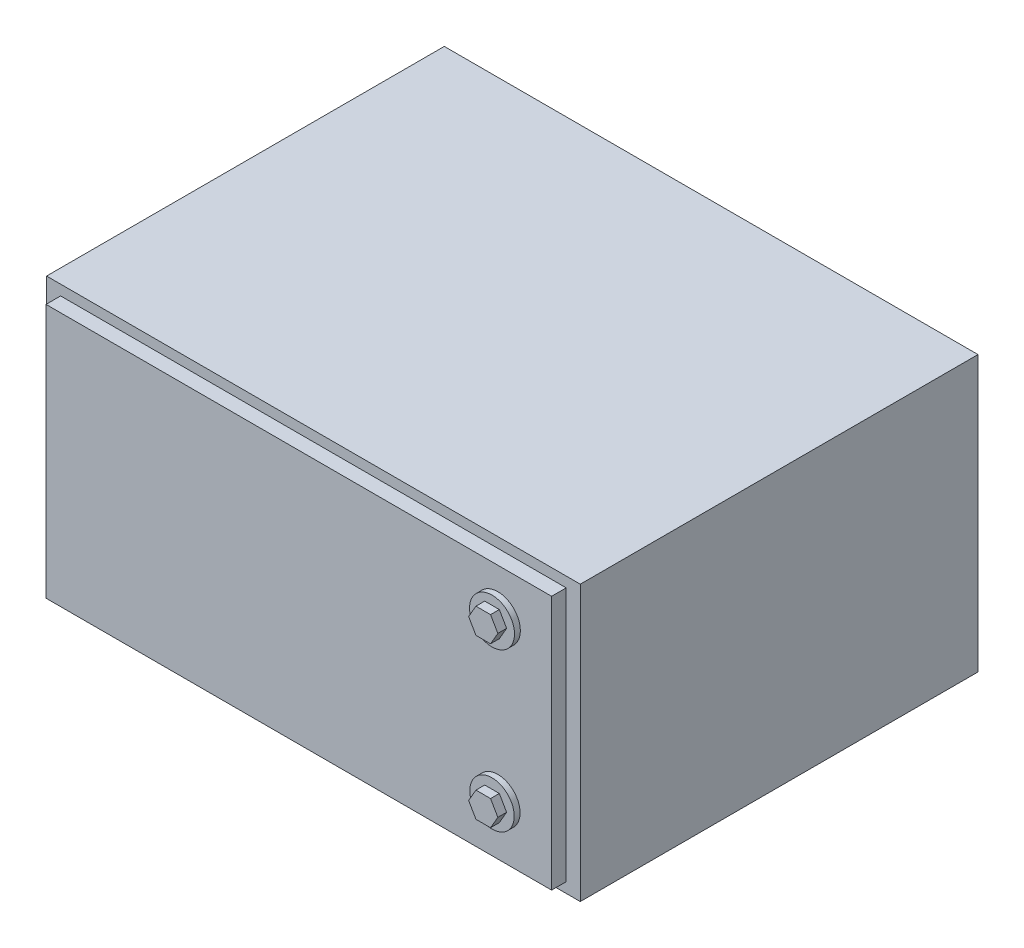
ISO-10303-21;
HEADER;
FILE_DESCRIPTION(('STEP AP214'),'2;1');
FILE_NAME('part.step','',(''),(''),'','','');
FILE_SCHEMA(('AUTOMOTIVE_DESIGN { 1 0 10303 214 1 1 1 1 }'));
ENDSEC;
DATA;
#1=APPLICATION_CONTEXT('core data for automotive mechanical design processes');
#2=APPLICATION_PROTOCOL_DEFINITION('international standard','automotive_design',2000,#1);
#3=PRODUCT_CONTEXT('',#1,'mechanical');
#4=PRODUCT('Part','Part','',(#3));
#5=PRODUCT_RELATED_PRODUCT_CATEGORY('part','',(#4));
#6=PRODUCT_DEFINITION_FORMATION('','',#4);
#7=PRODUCT_DEFINITION_CONTEXT('part definition',#1,'design');
#8=PRODUCT_DEFINITION('design','',#6,#7);
#9=PRODUCT_DEFINITION_SHAPE('','',#8);
#10=(LENGTH_UNIT() NAMED_UNIT(*) SI_UNIT(.MILLI.,.METRE.));
#11=(NAMED_UNIT(*) PLANE_ANGLE_UNIT() SI_UNIT($,.RADIAN.));
#12=(NAMED_UNIT(*) SI_UNIT($,.STERADIAN.) SOLID_ANGLE_UNIT());
#13=UNCERTAINTY_MEASURE_WITH_UNIT(LENGTH_MEASURE(1.E-05),#10,'distance_accuracy_value','');
#14=(GEOMETRIC_REPRESENTATION_CONTEXT(3) GLOBAL_UNCERTAINTY_ASSIGNED_CONTEXT((#13)) GLOBAL_UNIT_ASSIGNED_CONTEXT((#10,
#11,#12)) REPRESENTATION_CONTEXT('',''));
#15=CARTESIAN_POINT('',(0.,0.,0.));
#16=DIRECTION('',(0.,0.,1.));
#17=DIRECTION('',(1.,0.,0.));
#18=AXIS2_PLACEMENT_3D('',#15,#16,#17);
#19=CARTESIAN_POINT('',(0.,0.,282.));
#20=DIRECTION('',(0.,0.,1.));
#21=DIRECTION('',(1.,0.,0.));
#22=AXIS2_PLACEMENT_3D('',#19,#20,#21);
#23=PLANE('',#22);
#24=CARTESIAN_POINT('',(136.141228207543,-52.0416494924864,282.));
#25=DIRECTION('',(0.,0.,1.));
#26=DIRECTION('',(1.,0.,0.));
#27=AXIS2_PLACEMENT_3D('',#24,#25,#26);
#28=CIRCLE('',#27,15.186201358837);
#29=CARTESIAN_POINT('',(151.32742956638,-52.0416494924864,282.));
#30=VERTEX_POINT('',#29);
#31=EDGE_CURVE('E204',#30,#30,#28,.T.);
#32=ORIENTED_EDGE('',*,*,#31,.F.);
#33=EDGE_LOOP('',(#32));
#34=FACE_BOUND('',#33,.T.);
#35=CARTESIAN_POINT('',(136.141228207543,56.0039711148531,282.));
#36=DIRECTION('',(0.,0.,1.));
#37=DIRECTION('',(1.,0.,0.));
#38=AXIS2_PLACEMENT_3D('',#35,#36,#37);
#39=CIRCLE('',#38,15.3722972644048);
#40=CARTESIAN_POINT('',(151.513525471948,56.0039711148531,282.));
#41=VERTEX_POINT('',#40);
#42=EDGE_CURVE('E395',#41,#41,#39,.T.);
#43=ORIENTED_EDGE('',*,*,#42,.F.);
#44=EDGE_LOOP('',(#43));
#45=FACE_BOUND('',#44,.T.);
#46=DIRECTION('',(0.,1.,0.));
#47=VECTOR('',#46,1.);
#48=CARTESIAN_POINT('',(172.887438002362,87.0225831909202,282.));
#49=LINE('',#48,#47);
#50=CARTESIAN_POINT('',(172.887438002362,-87.0225831909202,282.));
#51=VERTEX_POINT('',#50);
#52=CARTESIAN_POINT('',(172.887438002362,87.0225831909202,282.));
#53=VERTEX_POINT('',#52);
#54=EDGE_CURVE('E280',#51,#53,#49,.T.);
#55=ORIENTED_EDGE('',*,*,#54,.T.);
#56=DIRECTION('',(-1.,0.,0.));
#57=VECTOR('',#56,1.);
#58=CARTESIAN_POINT('',(-172.887438002362,87.0225831909202,282.));
#59=LINE('',#58,#57);
#60=CARTESIAN_POINT('',(-172.887438002362,87.0225831909202,282.));
#61=VERTEX_POINT('',#60);
#62=EDGE_CURVE('E284',#53,#61,#59,.T.);
#63=ORIENTED_EDGE('',*,*,#62,.T.);
#64=DIRECTION('',(0.,-1.,0.));
#65=VECTOR('',#64,1.);
#66=CARTESIAN_POINT('',(-172.887438002362,87.0225831909202,282.));
#67=LINE('',#66,#65);
#68=CARTESIAN_POINT('',(-172.887438002362,-87.0225831909202,282.));
#69=VERTEX_POINT('',#68);
#70=EDGE_CURVE('E288',#61,#69,#67,.T.);
#71=ORIENTED_EDGE('',*,*,#70,.T.);
#72=DIRECTION('',(1.,0.,0.));
#73=VECTOR('',#72,1.);
#74=CARTESIAN_POINT('',(-172.887438002362,-87.0225831909202,282.));
#75=LINE('',#74,#73);
#76=EDGE_CURVE('E291',#69,#51,#75,.T.);
#77=ORIENTED_EDGE('',*,*,#76,.T.);
#78=EDGE_LOOP('',(#55,#63,#71,#77));
#79=FACE_BOUND('',#78,.T.);
#80=ADVANCED_FACE('F51',(#34,#45,#79),#23,.T.);
#81=CARTESIAN_POINT('',(182.5,94.,272.));
#82=DIRECTION('',(-1.,0.,0.));
#83=DIRECTION('',(0.,-1.,0.));
#84=AXIS2_PLACEMENT_3D('',#81,#82,#83);
#85=PLANE('',#84);
#86=DIRECTION('',(0.,1.,0.));
#87=VECTOR('',#86,1.);
#88=CARTESIAN_POINT('',(182.5,94.,0.));
#89=LINE('',#88,#87);
#90=CARTESIAN_POINT('',(182.5,-94.,0.));
#91=VERTEX_POINT('',#90);
#92=CARTESIAN_POINT('',(182.5,94.,0.));
#93=VERTEX_POINT('',#92);
#94=EDGE_CURVE('E324',#91,#93,#89,.T.);
#95=ORIENTED_EDGE('',*,*,#94,.T.);
#96=DIRECTION('',(0.,0.,-1.));
#97=VECTOR('',#96,1.);
#98=CARTESIAN_POINT('',(182.5,94.,272.));
#99=LINE('',#98,#97);
#100=CARTESIAN_POINT('',(182.5,94.,272.));
#101=VERTEX_POINT('',#100);
#102=EDGE_CURVE('E362',#101,#93,#99,.T.);
#103=ORIENTED_EDGE('',*,*,#102,.F.);
#104=DIRECTION('',(0.,1.,0.));
#105=VECTOR('',#104,1.);
#106=CARTESIAN_POINT('',(182.5,94.,272.));
#107=LINE('',#106,#105);
#108=CARTESIAN_POINT('',(182.5,-94.,272.));
#109=VERTEX_POINT('',#108);
#110=EDGE_CURVE('E325',#109,#101,#107,.T.);
#111=ORIENTED_EDGE('',*,*,#110,.F.);
#112=DIRECTION('',(0.,0.,-1.));
#113=VECTOR('',#112,1.);
#114=CARTESIAN_POINT('',(182.5,-94.,272.));
#115=LINE('',#114,#113);
#116=EDGE_CURVE('E339',#109,#91,#115,.T.);
#117=ORIENTED_EDGE('',*,*,#116,.T.);
#118=EDGE_LOOP('',(#95,#103,#111,#117));
#119=FACE_BOUND('',#118,.T.);
#120=ADVANCED_FACE('F53',(#119),#85,.F.);
#121=CARTESIAN_POINT('',(-182.5,94.,272.));
#122=DIRECTION('',(0.,-1.,0.));
#123=DIRECTION('',(0.,0.,-1.));
#124=AXIS2_PLACEMENT_3D('',#121,#122,#123);
#125=PLANE('',#124);
#126=DIRECTION('',(-1.,0.,0.));
#127=VECTOR('',#126,1.);
#128=CARTESIAN_POINT('',(-182.5,94.,0.));
#129=LINE('',#128,#127);
#130=CARTESIAN_POINT('',(-182.5,94.,0.));
#131=VERTEX_POINT('',#130);
#132=EDGE_CURVE('E343',#93,#131,#129,.T.);
#133=ORIENTED_EDGE('',*,*,#132,.T.);
#134=DIRECTION('',(0.,0.,-1.));
#135=VECTOR('',#134,1.);
#136=CARTESIAN_POINT('',(-182.5,94.,272.));
#137=LINE('',#136,#135);
#138=CARTESIAN_POINT('',(-182.5,94.,272.));
#139=VERTEX_POINT('',#138);
#140=EDGE_CURVE('E358',#139,#131,#137,.T.);
#141=ORIENTED_EDGE('',*,*,#140,.F.);
#142=DIRECTION('',(-1.,0.,0.));
#143=VECTOR('',#142,1.);
#144=CARTESIAN_POINT('',(-182.5,94.,272.));
#145=LINE('',#144,#143);
#146=EDGE_CURVE('E329',#101,#139,#145,.T.);
#147=ORIENTED_EDGE('',*,*,#146,.F.);
#148=ORIENTED_EDGE('',*,*,#102,.T.);
#149=EDGE_LOOP('',(#133,#141,#147,#148));
#150=FACE_BOUND('',#149,.T.);
#151=ADVANCED_FACE('F479',(#150),#125,.F.);
#152=CARTESIAN_POINT('',(-182.5,94.,272.));
#153=DIRECTION('',(1.,0.,0.));
#154=DIRECTION('',(0.,0.,-1.));
#155=AXIS2_PLACEMENT_3D('',#152,#153,#154);
#156=PLANE('',#155);
#157=DIRECTION('',(0.,-1.,0.));
#158=VECTOR('',#157,1.);
#159=CARTESIAN_POINT('',(-182.5,94.,0.));
#160=LINE('',#159,#158);
#161=CARTESIAN_POINT('',(-182.5,-94.,0.));
#162=VERTEX_POINT('',#161);
#163=EDGE_CURVE('E346',#131,#162,#160,.T.);
#164=ORIENTED_EDGE('',*,*,#163,.T.);
#165=DIRECTION('',(0.,0.,-1.));
#166=VECTOR('',#165,1.);
#167=CARTESIAN_POINT('',(-182.5,-94.,272.));
#168=LINE('',#167,#166);
#169=CARTESIAN_POINT('',(-182.5,-94.,272.));
#170=VERTEX_POINT('',#169);
#171=EDGE_CURVE('E354',#170,#162,#168,.T.);
#172=ORIENTED_EDGE('',*,*,#171,.F.);
#173=DIRECTION('',(0.,-1.,0.));
#174=VECTOR('',#173,1.);
#175=CARTESIAN_POINT('',(-182.5,94.,272.));
#176=LINE('',#175,#174);
#177=EDGE_CURVE('E333',#139,#170,#176,.T.);
#178=ORIENTED_EDGE('',*,*,#177,.F.);
#179=ORIENTED_EDGE('',*,*,#140,.T.);
#180=EDGE_LOOP('',(#164,#172,#178,#179));
#181=FACE_BOUND('',#180,.T.);
#182=ADVANCED_FACE('F484',(#181),#156,.F.);
#183=CARTESIAN_POINT('',(-182.5,-94.,272.));
#184=DIRECTION('',(0.,1.,0.));
#185=DIRECTION('',(0.,0.,1.));
#186=AXIS2_PLACEMENT_3D('',#183,#184,#185);
#187=PLANE('',#186);
#188=DIRECTION('',(1.,0.,0.));
#189=VECTOR('',#188,1.);
#190=CARTESIAN_POINT('',(-182.5,-94.,0.));
#191=LINE('',#190,#189);
#192=EDGE_CURVE('E330',#162,#91,#191,.T.);
#193=ORIENTED_EDGE('',*,*,#192,.T.);
#194=ORIENTED_EDGE('',*,*,#116,.F.);
#195=DIRECTION('',(1.,0.,0.));
#196=VECTOR('',#195,1.);
#197=CARTESIAN_POINT('',(-182.5,-94.,272.));
#198=LINE('',#197,#196);
#199=EDGE_CURVE('E336',#170,#109,#198,.T.);
#200=ORIENTED_EDGE('',*,*,#199,.F.);
#201=ORIENTED_EDGE('',*,*,#171,.T.);
#202=EDGE_LOOP('',(#193,#194,#200,#201));
#203=FACE_BOUND('',#202,.T.);
#204=ADVANCED_FACE('F469',(#203),#187,.F.);
#205=CARTESIAN_POINT('',(0.,0.,272.));
#206=DIRECTION('',(0.,0.,1.));
#207=DIRECTION('',(1.,0.,0.));
#208=AXIS2_PLACEMENT_3D('',#205,#206,#207);
#209=PLANE('',#208);
#210=DIRECTION('',(0.,1.,0.));
#211=VECTOR('',#210,1.);
#212=CARTESIAN_POINT('',(172.887438002362,87.0225831909202,272.));
#213=LINE('',#212,#211);
#214=CARTESIAN_POINT('',(172.887438002362,-87.0225831909202,272.));
#215=VERTEX_POINT('',#214);
#216=CARTESIAN_POINT('',(172.887438002362,87.0225831909202,272.));
#217=VERTEX_POINT('',#216);
#218=EDGE_CURVE('E279',#215,#217,#213,.T.);
#219=ORIENTED_EDGE('',*,*,#218,.F.);
#220=DIRECTION('',(1.,0.,0.));
#221=VECTOR('',#220,1.);
#222=CARTESIAN_POINT('',(-172.887438002362,-87.0225831909202,272.));
#223=LINE('',#222,#221);
#224=CARTESIAN_POINT('',(-172.887438002362,-87.0225831909202,272.));
#225=VERTEX_POINT('',#224);
#226=EDGE_CURVE('E285',#225,#215,#223,.T.);
#227=ORIENTED_EDGE('',*,*,#226,.F.);
#228=DIRECTION('',(0.,-1.,0.));
#229=VECTOR('',#228,1.);
#230=CARTESIAN_POINT('',(-172.887438002362,87.0225831909202,272.));
#231=LINE('',#230,#229);
#232=CARTESIAN_POINT('',(-172.887438002362,87.0225831909202,272.));
#233=VERTEX_POINT('',#232);
#234=EDGE_CURVE('E302',#233,#225,#231,.T.);
#235=ORIENTED_EDGE('',*,*,#234,.F.);
#236=DIRECTION('',(-1.,0.,0.));
#237=VECTOR('',#236,1.);
#238=CARTESIAN_POINT('',(-172.887438002362,87.0225831909202,272.));
#239=LINE('',#238,#237);
#240=EDGE_CURVE('E298',#217,#233,#239,.T.);
#241=ORIENTED_EDGE('',*,*,#240,.F.);
#242=EDGE_LOOP('',(#219,#227,#235,#241));
#243=FACE_BOUND('',#242,.T.);
#244=ORIENTED_EDGE('',*,*,#110,.T.);
#245=ORIENTED_EDGE('',*,*,#146,.T.);
#246=ORIENTED_EDGE('',*,*,#177,.T.);
#247=ORIENTED_EDGE('',*,*,#199,.T.);
#248=EDGE_LOOP('',(#244,#245,#246,#247));
#249=FACE_BOUND('',#248,.T.);
#250=ADVANCED_FACE('F465',(#243,#249),#209,.T.);
#251=CARTESIAN_POINT('',(0.,0.,0.));
#252=DIRECTION('',(0.,0.,1.));
#253=DIRECTION('',(1.,0.,0.));
#254=AXIS2_PLACEMENT_3D('',#251,#252,#253);
#255=PLANE('',#254);
#256=ORIENTED_EDGE('',*,*,#94,.F.);
#257=ORIENTED_EDGE('',*,*,#192,.F.);
#258=ORIENTED_EDGE('',*,*,#163,.F.);
#259=ORIENTED_EDGE('',*,*,#132,.F.);
#260=EDGE_LOOP('',(#256,#257,#258,#259));
#261=FACE_BOUND('',#260,.T.);
#262=ADVANCED_FACE('F468',(#261),#255,.F.);
#263=CARTESIAN_POINT('',(172.887438002362,87.0225831909202,282.));
#264=DIRECTION('',(-1.,0.,0.));
#265=DIRECTION('',(0.,0.,1.));
#266=AXIS2_PLACEMENT_3D('',#263,#264,#265);
#267=PLANE('',#266);
#268=ORIENTED_EDGE('',*,*,#218,.T.);
#269=DIRECTION('',(0.,0.,-1.));
#270=VECTOR('',#269,1.);
#271=CARTESIAN_POINT('',(172.887438002362,87.0225831909202,282.));
#272=LINE('',#271,#270);
#273=EDGE_CURVE('E320',#53,#217,#272,.T.);
#274=ORIENTED_EDGE('',*,*,#273,.F.);
#275=ORIENTED_EDGE('',*,*,#54,.F.);
#276=DIRECTION('',(0.,0.,-1.));
#277=VECTOR('',#276,1.);
#278=CARTESIAN_POINT('',(172.887438002362,-87.0225831909202,282.));
#279=LINE('',#278,#277);
#280=EDGE_CURVE('E294',#51,#215,#279,.T.);
#281=ORIENTED_EDGE('',*,*,#280,.T.);
#282=EDGE_LOOP('',(#268,#274,#275,#281));
#283=FACE_BOUND('',#282,.T.);
#284=ADVANCED_FACE('F455',(#283),#267,.F.);
#285=CARTESIAN_POINT('',(-172.887438002362,87.0225831909202,282.));
#286=DIRECTION('',(0.,-1.,0.));
#287=DIRECTION('',(0.,0.,-1.));
#288=AXIS2_PLACEMENT_3D('',#285,#286,#287);
#289=PLANE('',#288);
#290=ORIENTED_EDGE('',*,*,#240,.T.);
#291=DIRECTION('',(0.,0.,-1.));
#292=VECTOR('',#291,1.);
#293=CARTESIAN_POINT('',(-172.887438002362,87.0225831909202,282.));
#294=LINE('',#293,#292);
#295=EDGE_CURVE('E316',#61,#233,#294,.T.);
#296=ORIENTED_EDGE('',*,*,#295,.F.);
#297=ORIENTED_EDGE('',*,*,#62,.F.);
#298=ORIENTED_EDGE('',*,*,#273,.T.);
#299=EDGE_LOOP('',(#290,#296,#297,#298));
#300=FACE_BOUND('',#299,.T.);
#301=ADVANCED_FACE('F457',(#300),#289,.F.);
#302=CARTESIAN_POINT('',(-172.887438002362,87.0225831909202,282.));
#303=DIRECTION('',(1.,0.,0.));
#304=DIRECTION('',(0.,0.,-1.));
#305=AXIS2_PLACEMENT_3D('',#302,#303,#304);
#306=PLANE('',#305);
#307=ORIENTED_EDGE('',*,*,#234,.T.);
#308=DIRECTION('',(0.,0.,-1.));
#309=VECTOR('',#308,1.);
#310=CARTESIAN_POINT('',(-172.887438002362,-87.0225831909202,282.));
#311=LINE('',#310,#309);
#312=EDGE_CURVE('E312',#69,#225,#311,.T.);
#313=ORIENTED_EDGE('',*,*,#312,.F.);
#314=ORIENTED_EDGE('',*,*,#70,.F.);
#315=ORIENTED_EDGE('',*,*,#295,.T.);
#316=EDGE_LOOP('',(#307,#313,#314,#315));
#317=FACE_BOUND('',#316,.T.);
#318=ADVANCED_FACE('F461',(#317),#306,.F.);
#319=CARTESIAN_POINT('',(-172.887438002362,-87.0225831909202,282.));
#320=DIRECTION('',(0.,1.,0.));
#321=DIRECTION('',(0.,0.,1.));
#322=AXIS2_PLACEMENT_3D('',#319,#320,#321);
#323=PLANE('',#322);
#324=ORIENTED_EDGE('',*,*,#226,.T.);
#325=ORIENTED_EDGE('',*,*,#280,.F.);
#326=ORIENTED_EDGE('',*,*,#76,.F.);
#327=ORIENTED_EDGE('',*,*,#312,.T.);
#328=EDGE_LOOP('',(#324,#325,#326,#327));
#329=FACE_BOUND('',#328,.T.);
#330=ADVANCED_FACE('F463',(#329),#323,.F.);
#331=CARTESIAN_POINT('',(136.141228207543,56.0039711148531,286.));
#332=DIRECTION('',(0.,0.,1.));
#333=DIRECTION('',(1.,0.,0.));
#334=AXIS2_PLACEMENT_3D('',#331,#332,#333);
#335=PLANE('',#334);
#336=CARTESIAN_POINT('',(136.141228207543,56.0039711148531,286.));
#337=DIRECTION('',(0.,0.,1.));
#338=DIRECTION('',(1.,0.,0.));
#339=AXIS2_PLACEMENT_3D('',#336,#337,#338);
#340=CIRCLE('',#339,15.3722972644048);
#341=CARTESIAN_POINT('',(151.513525471948,56.0039711148531,286.));
#342=VERTEX_POINT('',#341);
#343=EDGE_CURVE('E388',#342,#342,#340,.T.);
#344=ORIENTED_EDGE('',*,*,#343,.T.);
#345=EDGE_LOOP('',(#344));
#346=FACE_BOUND('',#345,.T.);
#347=DIRECTION('',(0.499999999999994,0.866025403784442,0.));
#348=VECTOR('',#347,1.);
#349=CARTESIAN_POINT('',(141.134054034866,47.9947144035055,286.));
#350=LINE('',#349,#348);
#351=CARTESIAN_POINT('',(141.134054034866,47.9947144035055,286.));
#352=VERTEX_POINT('',#351);
#353=CARTESIAN_POINT('',(146.12687986219,56.6425424097719,286.));
#354=VERTEX_POINT('',#353);
#355=EDGE_CURVE('E74',#352,#354,#350,.T.);
#356=ORIENTED_EDGE('',*,*,#355,.F.);
#357=DIRECTION('',(1.,0.,0.));
#358=VECTOR('',#357,1.);
#359=CARTESIAN_POINT('',(131.148402380219,47.9947144035054,286.));
#360=LINE('',#359,#358);
#361=CARTESIAN_POINT('',(131.148402380219,47.9947144035054,286.));
#362=VERTEX_POINT('',#361);
#363=EDGE_CURVE('E60',#362,#352,#360,.T.);
#364=ORIENTED_EDGE('',*,*,#363,.F.);
#365=DIRECTION('',(0.500000000000007,-0.866025403784434,0.));
#366=VECTOR('',#365,1.);
#367=CARTESIAN_POINT('',(126.155576552896,56.6425424097718,286.));
#368=LINE('',#367,#366);
#369=CARTESIAN_POINT('',(126.155576552896,56.6425424097718,286.));
#370=VERTEX_POINT('',#369);
#371=EDGE_CURVE('E384',#370,#362,#368,.T.);
#372=ORIENTED_EDGE('',*,*,#371,.F.);
#373=DIRECTION('',(-0.499999999999996,-0.866025403784441,0.));
#374=VECTOR('',#373,1.);
#375=CARTESIAN_POINT('',(131.148402380219,65.2903704160383,286.));
#376=LINE('',#375,#374);
#377=CARTESIAN_POINT('',(131.148402380219,65.2903704160383,286.));
#378=VERTEX_POINT('',#377);
#379=EDGE_CURVE('E387',#378,#370,#376,.T.);
#380=ORIENTED_EDGE('',*,*,#379,.F.);
#381=DIRECTION('',(-1.,0.,0.));
#382=VECTOR('',#381,1.);
#383=CARTESIAN_POINT('',(141.134054034866,65.2903704160383,286.));
#384=LINE('',#383,#382);
#385=CARTESIAN_POINT('',(141.134054034866,65.2903704160383,286.));
#386=VERTEX_POINT('',#385);
#387=EDGE_CURVE('E392',#386,#378,#384,.T.);
#388=ORIENTED_EDGE('',*,*,#387,.F.);
#389=DIRECTION('',(-0.500000000000002,0.866025403784438,0.));
#390=VECTOR('',#389,1.);
#391=CARTESIAN_POINT('',(146.12687986219,56.6425424097719,286.));
#392=LINE('',#391,#390);
#393=EDGE_CURVE('E402',#354,#386,#392,.T.);
#394=ORIENTED_EDGE('',*,*,#393,.F.);
#395=EDGE_LOOP('',(#356,#364,#372,#380,#388,#394));
#396=FACE_BOUND('',#395,.T.);
#397=ADVANCED_FACE('F562',(#346,#396),#335,.T.);
#398=CARTESIAN_POINT('',(136.141228207543,56.0039711148531,286.));
#399=DIRECTION('',(0.,0.,-1.));
#400=DIRECTION('',(-1.,0.,0.));
#401=AXIS2_PLACEMENT_3D('',#398,#399,#400);
#402=CYLINDRICAL_SURFACE('',#401,15.3722972644048);
#403=ORIENTED_EDGE('',*,*,#343,.F.);
#404=EDGE_LOOP('',(#403));
#405=FACE_BOUND('',#404,.T.);
#406=ORIENTED_EDGE('',*,*,#42,.T.);
#407=EDGE_LOOP('',(#406));
#408=FACE_BOUND('',#407,.T.);
#409=ADVANCED_FACE('F443',(#405,#408),#402,.T.);
#410=CARTESIAN_POINT('',(0.,0.,292.));
#411=DIRECTION('',(0.,0.,1.));
#412=DIRECTION('',(1.,0.,0.));
#413=AXIS2_PLACEMENT_3D('',#410,#411,#412);
#414=PLANE('',#413);
#415=DIRECTION('',(0.499999999999994,0.866025403784442,0.));
#416=VECTOR('',#415,1.);
#417=CARTESIAN_POINT('',(141.134054034866,47.9947144035055,292.));
#418=LINE('',#417,#416);
#419=CARTESIAN_POINT('',(141.134054034866,47.9947144035055,292.));
#420=VERTEX_POINT('',#419);
#421=CARTESIAN_POINT('',(146.12687986219,56.6425424097719,292.));
#422=VERTEX_POINT('',#421);
#423=EDGE_CURVE('E236',#420,#422,#418,.T.);
#424=ORIENTED_EDGE('',*,*,#423,.T.);
#425=DIRECTION('',(-0.500000000000002,0.866025403784438,0.));
#426=VECTOR('',#425,1.);
#427=CARTESIAN_POINT('',(146.12687986219,56.6425424097719,292.));
#428=LINE('',#427,#426);
#429=CARTESIAN_POINT('',(141.134054034866,65.2903704160383,292.));
#430=VERTEX_POINT('',#429);
#431=EDGE_CURVE('E240',#422,#430,#428,.T.);
#432=ORIENTED_EDGE('',*,*,#431,.T.);
#433=DIRECTION('',(-1.,0.,0.));
#434=VECTOR('',#433,1.);
#435=CARTESIAN_POINT('',(141.134054034866,65.2903704160383,292.));
#436=LINE('',#435,#434);
#437=CARTESIAN_POINT('',(131.148402380219,65.2903704160383,292.));
#438=VERTEX_POINT('',#437);
#439=EDGE_CURVE('E243',#430,#438,#436,.T.);
#440=ORIENTED_EDGE('',*,*,#439,.T.);
#441=DIRECTION('',(-0.499999999999996,-0.866025403784441,0.));
#442=VECTOR('',#441,1.);
#443=CARTESIAN_POINT('',(131.148402380219,65.2903704160383,292.));
#444=LINE('',#443,#442);
#445=CARTESIAN_POINT('',(126.155576552896,56.6425424097718,292.));
#446=VERTEX_POINT('',#445);
#447=EDGE_CURVE('E246',#438,#446,#444,.T.);
#448=ORIENTED_EDGE('',*,*,#447,.T.);
#449=DIRECTION('',(0.500000000000007,-0.866025403784434,0.));
#450=VECTOR('',#449,1.);
#451=CARTESIAN_POINT('',(126.155576552896,56.6425424097718,292.));
#452=LINE('',#451,#450);
#453=CARTESIAN_POINT('',(131.148402380219,47.9947144035054,292.));
#454=VERTEX_POINT('',#453);
#455=EDGE_CURVE('E249',#446,#454,#452,.T.);
#456=ORIENTED_EDGE('',*,*,#455,.T.);
#457=DIRECTION('',(1.,0.,0.));
#458=VECTOR('',#457,1.);
#459=CARTESIAN_POINT('',(131.148402380219,47.9947144035054,292.));
#460=LINE('',#459,#458);
#461=EDGE_CURVE('E252',#454,#420,#460,.T.);
#462=ORIENTED_EDGE('',*,*,#461,.T.);
#463=EDGE_LOOP('',(#424,#432,#440,#448,#456,#462));
#464=FACE_BOUND('',#463,.T.);
#465=ADVANCED_FACE('F377',(#464),#414,.T.);
#466=CARTESIAN_POINT('',(131.148402380219,47.9947144035054,292.));
#467=DIRECTION('',(0.,1.,0.));
#468=DIRECTION('',(-1.,0.,0.));
#469=AXIS2_PLACEMENT_3D('',#466,#467,#468);
#470=PLANE('',#469);
#471=DIRECTION('',(0.,0.,-1.));
#472=VECTOR('',#471,1.);
#473=CARTESIAN_POINT('',(131.148402380219,47.9947144035054,292.));
#474=LINE('',#473,#472);
#475=EDGE_CURVE('E259',#454,#362,#474,.T.);
#476=ORIENTED_EDGE('',*,*,#475,.T.);
#477=ORIENTED_EDGE('',*,*,#363,.T.);
#478=DIRECTION('',(0.,0.,-1.));
#479=VECTOR('',#478,1.);
#480=CARTESIAN_POINT('',(141.134054034866,47.9947144035055,292.));
#481=LINE('',#480,#479);
#482=EDGE_CURVE('E255',#420,#352,#481,.T.);
#483=ORIENTED_EDGE('',*,*,#482,.F.);
#484=ORIENTED_EDGE('',*,*,#461,.F.);
#485=EDGE_LOOP('',(#476,#477,#483,#484));
#486=FACE_BOUND('',#485,.T.);
#487=ADVANCED_FACE('F368',(#486),#470,.F.);
#488=CARTESIAN_POINT('',(126.155576552896,56.6425424097718,292.));
#489=DIRECTION('',(0.866025403784434,0.500000000000007,0.));
#490=DIRECTION('',(-0.500000000000007,0.866025403784434,0.));
#491=AXIS2_PLACEMENT_3D('',#488,#489,#490);
#492=PLANE('',#491);
#493=DIRECTION('',(0.,0.,-1.));
#494=VECTOR('',#493,1.);
#495=CARTESIAN_POINT('',(126.155576552896,56.6425424097718,292.));
#496=LINE('',#495,#494);
#497=EDGE_CURVE('E263',#446,#370,#496,.T.);
#498=ORIENTED_EDGE('',*,*,#497,.T.);
#499=ORIENTED_EDGE('',*,*,#371,.T.);
#500=ORIENTED_EDGE('',*,*,#475,.F.);
#501=ORIENTED_EDGE('',*,*,#455,.F.);
#502=EDGE_LOOP('',(#498,#499,#500,#501));
#503=FACE_BOUND('',#502,.T.);
#504=ADVANCED_FACE('F383',(#503),#492,.F.);
#505=CARTESIAN_POINT('',(131.148402380219,65.2903704160383,292.));
#506=DIRECTION('',(0.866025403784441,-0.499999999999996,0.));
#507=DIRECTION('',(0.499999999999996,0.866025403784441,0.));
#508=AXIS2_PLACEMENT_3D('',#505,#506,#507);
#509=PLANE('',#508);
#510=DIRECTION('',(0.,0.,-1.));
#511=VECTOR('',#510,1.);
#512=CARTESIAN_POINT('',(131.148402380219,65.2903704160383,292.));
#513=LINE('',#512,#511);
#514=EDGE_CURVE('E267',#438,#378,#513,.T.);
#515=ORIENTED_EDGE('',*,*,#514,.T.);
#516=ORIENTED_EDGE('',*,*,#379,.T.);
#517=ORIENTED_EDGE('',*,*,#497,.F.);
#518=ORIENTED_EDGE('',*,*,#447,.F.);
#519=EDGE_LOOP('',(#515,#516,#517,#518));
#520=FACE_BOUND('',#519,.T.);
#521=ADVANCED_FACE('F605',(#520),#509,.F.);
#522=CARTESIAN_POINT('',(141.134054034866,65.2903704160383,292.));
#523=DIRECTION('',(0.,-1.,0.));
#524=DIRECTION('',(1.,0.,0.));
#525=AXIS2_PLACEMENT_3D('',#522,#523,#524);
#526=PLANE('',#525);
#527=DIRECTION('',(0.,0.,-1.));
#528=VECTOR('',#527,1.);
#529=CARTESIAN_POINT('',(141.134054034866,65.2903704160383,292.));
#530=LINE('',#529,#528);
#531=EDGE_CURVE('E271',#430,#386,#530,.T.);
#532=ORIENTED_EDGE('',*,*,#531,.T.);
#533=ORIENTED_EDGE('',*,*,#387,.T.);
#534=ORIENTED_EDGE('',*,*,#514,.F.);
#535=ORIENTED_EDGE('',*,*,#439,.F.);
#536=EDGE_LOOP('',(#532,#533,#534,#535));
#537=FACE_BOUND('',#536,.T.);
#538=ADVANCED_FACE('F593',(#537),#526,.F.);
#539=CARTESIAN_POINT('',(146.12687986219,56.6425424097719,292.));
#540=DIRECTION('',(-0.866025403784438,-0.500000000000002,0.));
#541=DIRECTION('',(0.500000000000002,-0.866025403784438,0.));
#542=AXIS2_PLACEMENT_3D('',#539,#540,#541);
#543=PLANE('',#542);
#544=DIRECTION('',(0.,0.,-1.));
#545=VECTOR('',#544,1.);
#546=CARTESIAN_POINT('',(146.12687986219,56.6425424097719,292.));
#547=LINE('',#546,#545);
#548=EDGE_CURVE('E275',#422,#354,#547,.T.);
#549=ORIENTED_EDGE('',*,*,#548,.T.);
#550=ORIENTED_EDGE('',*,*,#393,.T.);
#551=ORIENTED_EDGE('',*,*,#531,.F.);
#552=ORIENTED_EDGE('',*,*,#431,.F.);
#553=EDGE_LOOP('',(#549,#550,#551,#552));
#554=FACE_BOUND('',#553,.T.);
#555=ADVANCED_FACE('F581',(#554),#543,.F.);
#556=CARTESIAN_POINT('',(141.134054034866,47.9947144035055,292.));
#557=DIRECTION('',(-0.866025403784442,0.499999999999994,0.));
#558=DIRECTION('',(-0.499999999999994,-0.866025403784442,0.));
#559=AXIS2_PLACEMENT_3D('',#556,#557,#558);
#560=PLANE('',#559);
#561=ORIENTED_EDGE('',*,*,#482,.T.);
#562=ORIENTED_EDGE('',*,*,#355,.T.);
#563=ORIENTED_EDGE('',*,*,#548,.F.);
#564=ORIENTED_EDGE('',*,*,#423,.F.);
#565=EDGE_LOOP('',(#561,#562,#563,#564));
#566=FACE_BOUND('',#565,.T.);
#567=ADVANCED_FACE('F374',(#566),#560,.F.);
#568=CARTESIAN_POINT('',(136.141228207543,-52.0416494924864,286.));
#569=DIRECTION('',(0.,0.,1.));
#570=DIRECTION('',(1.,0.,0.));
#571=AXIS2_PLACEMENT_3D('',#568,#569,#570);
#572=PLANE('',#571);
#573=CARTESIAN_POINT('',(136.141228207543,-52.0416494924864,286.));
#574=DIRECTION('',(0.,0.,1.));
#575=DIRECTION('',(1.,0.,0.));
#576=AXIS2_PLACEMENT_3D('',#573,#574,#575);
#577=CIRCLE('',#576,15.186201358837);
#578=CARTESIAN_POINT('',(151.32742956638,-52.0416494924864,286.));
#579=VERTEX_POINT('',#578);
#580=EDGE_CURVE('E814',#579,#579,#577,.T.);
#581=ORIENTED_EDGE('',*,*,#580,.T.);
#582=EDGE_LOOP('',(#581));
#583=FACE_BOUND('',#582,.T.);
#584=DIRECTION('',(0.499999999999995,0.866025403784441,0.));
#585=VECTOR('',#584,1.);
#586=CARTESIAN_POINT('',(141.134054034866,-60.9373744069267,286.));
#587=LINE('',#586,#585);
#588=CARTESIAN_POINT('',(141.134054034866,-60.9373744069267,286.));
#589=VERTEX_POINT('',#588);
#590=CARTESIAN_POINT('',(146.12687986219,-52.2895464006603,286.));
#591=VERTEX_POINT('',#590);
#592=EDGE_CURVE('E67',#589,#591,#587,.T.);
#593=ORIENTED_EDGE('',*,*,#592,.F.);
#594=DIRECTION('',(1.,0.,0.));
#595=VECTOR('',#594,1.);
#596=CARTESIAN_POINT('',(131.148402380219,-60.9373744069268,286.));
#597=LINE('',#596,#595);
#598=CARTESIAN_POINT('',(131.148402380219,-60.9373744069268,286.));
#599=VERTEX_POINT('',#598);
#600=EDGE_CURVE('E11',#599,#589,#597,.T.);
#601=ORIENTED_EDGE('',*,*,#600,.F.);
#602=DIRECTION('',(0.500000000000006,-0.866025403784435,0.));
#603=VECTOR('',#602,1.);
#604=CARTESIAN_POINT('',(126.155576552896,-52.2895464006604,286.));
#605=LINE('',#604,#603);
#606=CARTESIAN_POINT('',(126.155576552896,-52.2895464006604,286.));
#607=VERTEX_POINT('',#606);
#608=EDGE_CURVE('E187',#607,#599,#605,.T.);
#609=ORIENTED_EDGE('',*,*,#608,.F.);
#610=DIRECTION('',(-0.499999999999995,-0.866025403784442,0.));
#611=VECTOR('',#610,1.);
#612=CARTESIAN_POINT('',(131.148402380219,-43.641718394394,286.));
#613=LINE('',#612,#611);
#614=CARTESIAN_POINT('',(131.148402380219,-43.641718394394,286.));
#615=VERTEX_POINT('',#614);
#616=EDGE_CURVE('E203',#615,#607,#613,.T.);
#617=ORIENTED_EDGE('',*,*,#616,.F.);
#618=DIRECTION('',(-1.,0.,0.));
#619=VECTOR('',#618,1.);
#620=CARTESIAN_POINT('',(141.134054034866,-43.6417183943939,286.));
#621=LINE('',#620,#619);
#622=CARTESIAN_POINT('',(141.134054034866,-43.6417183943939,286.));
#623=VERTEX_POINT('',#622);
#624=EDGE_CURVE('E425',#623,#615,#621,.T.);
#625=ORIENTED_EDGE('',*,*,#624,.F.);
#626=DIRECTION('',(-0.500000000000001,0.866025403784438,0.));
#627=VECTOR('',#626,1.);
#628=CARTESIAN_POINT('',(146.12687986219,-52.2895464006603,286.));
#629=LINE('',#628,#627);
#630=EDGE_CURVE('E429',#591,#623,#629,.T.);
#631=ORIENTED_EDGE('',*,*,#630,.F.);
#632=EDGE_LOOP('',(#593,#601,#609,#617,#625,#631));
#633=FACE_BOUND('',#632,.T.);
#634=ADVANCED_FACE('F186',(#583,#633),#572,.T.);
#635=CARTESIAN_POINT('',(136.141228207543,-52.0416494924864,286.));
#636=DIRECTION('',(0.,0.,-1.));
#637=DIRECTION('',(-1.,0.,0.));
#638=AXIS2_PLACEMENT_3D('',#635,#636,#637);
#639=CYLINDRICAL_SURFACE('',#638,15.186201358837);
#640=ORIENTED_EDGE('',*,*,#580,.F.);
#641=EDGE_LOOP('',(#640));
#642=FACE_BOUND('',#641,.T.);
#643=ORIENTED_EDGE('',*,*,#31,.T.);
#644=EDGE_LOOP('',(#643));
#645=FACE_BOUND('',#644,.T.);
#646=ADVANCED_FACE('F722',(#642,#645),#639,.T.);
#647=CARTESIAN_POINT('',(0.,0.,292.));
#648=DIRECTION('',(0.,0.,1.));
#649=DIRECTION('',(1.,0.,0.));
#650=AXIS2_PLACEMENT_3D('',#647,#648,#649);
#651=PLANE('',#650);
#652=DIRECTION('',(0.499999999999995,0.866025403784441,0.));
#653=VECTOR('',#652,1.);
#654=CARTESIAN_POINT('',(141.134054034866,-60.9373744069267,292.));
#655=LINE('',#654,#653);
#656=CARTESIAN_POINT('',(141.134054034866,-60.9373744069267,292.));
#657=VERTEX_POINT('',#656);
#658=CARTESIAN_POINT('',(146.12687986219,-52.2895464006603,292.));
#659=VERTEX_POINT('',#658);
#660=EDGE_CURVE('E232',#657,#659,#655,.T.);
#661=ORIENTED_EDGE('',*,*,#660,.T.);
#662=DIRECTION('',(-0.500000000000001,0.866025403784438,0.));
#663=VECTOR('',#662,1.);
#664=CARTESIAN_POINT('',(146.12687986219,-52.2895464006603,292.));
#665=LINE('',#664,#663);
#666=CARTESIAN_POINT('',(141.134054034866,-43.6417183943939,292.));
#667=VERTEX_POINT('',#666);
#668=EDGE_CURVE('E229',#659,#667,#665,.T.);
#669=ORIENTED_EDGE('',*,*,#668,.T.);
#670=DIRECTION('',(-1.,0.,0.));
#671=VECTOR('',#670,1.);
#672=CARTESIAN_POINT('',(141.134054034866,-43.6417183943939,292.));
#673=LINE('',#672,#671);
#674=CARTESIAN_POINT('',(131.148402380219,-43.641718394394,292.));
#675=VERTEX_POINT('',#674);
#676=EDGE_CURVE('E226',#667,#675,#673,.T.);
#677=ORIENTED_EDGE('',*,*,#676,.T.);
#678=DIRECTION('',(-0.499999999999995,-0.866025403784442,0.));
#679=VECTOR('',#678,1.);
#680=CARTESIAN_POINT('',(131.148402380219,-43.641718394394,292.));
#681=LINE('',#680,#679);
#682=CARTESIAN_POINT('',(126.155576552896,-52.2895464006604,292.));
#683=VERTEX_POINT('',#682);
#684=EDGE_CURVE('E223',#675,#683,#681,.T.);
#685=ORIENTED_EDGE('',*,*,#684,.T.);
#686=DIRECTION('',(0.500000000000006,-0.866025403784435,0.));
#687=VECTOR('',#686,1.);
#688=CARTESIAN_POINT('',(126.155576552896,-52.2895464006604,292.));
#689=LINE('',#688,#687);
#690=CARTESIAN_POINT('',(131.148402380219,-60.9373744069268,292.));
#691=VERTEX_POINT('',#690);
#692=EDGE_CURVE('E220',#683,#691,#689,.T.);
#693=ORIENTED_EDGE('',*,*,#692,.T.);
#694=DIRECTION('',(1.,0.,0.));
#695=VECTOR('',#694,1.);
#696=CARTESIAN_POINT('',(131.148402380219,-60.9373744069268,292.));
#697=LINE('',#696,#695);
#698=EDGE_CURVE('E207',#691,#657,#697,.T.);
#699=ORIENTED_EDGE('',*,*,#698,.T.);
#700=EDGE_LOOP('',(#661,#669,#677,#685,#693,#699));
#701=FACE_BOUND('',#700,.T.);
#702=ADVANCED_FACE('F711',(#701),#651,.T.);
#703=CARTESIAN_POINT('',(131.148402380219,-60.9373744069268,292.));
#704=DIRECTION('',(0.,1.,0.));
#705=DIRECTION('',(-1.,0.,0.));
#706=AXIS2_PLACEMENT_3D('',#703,#704,#705);
#707=PLANE('',#706);
#708=DIRECTION('',(0.,0.,-1.));
#709=VECTOR('',#708,1.);
#710=CARTESIAN_POINT('',(131.148402380219,-60.9373744069268,292.));
#711=LINE('',#710,#709);
#712=EDGE_CURVE('E198',#691,#599,#711,.T.);
#713=ORIENTED_EDGE('',*,*,#712,.T.);
#714=ORIENTED_EDGE('',*,*,#600,.T.);
#715=DIRECTION('',(0.,0.,-1.));
#716=VECTOR('',#715,1.);
#717=CARTESIAN_POINT('',(141.134054034866,-60.9373744069267,292.));
#718=LINE('',#717,#716);
#719=EDGE_CURVE('E209',#657,#589,#718,.T.);
#720=ORIENTED_EDGE('',*,*,#719,.F.);
#721=ORIENTED_EDGE('',*,*,#698,.F.);
#722=EDGE_LOOP('',(#713,#714,#720,#721));
#723=FACE_BOUND('',#722,.T.);
#724=ADVANCED_FACE('F206',(#723),#707,.F.);
#725=CARTESIAN_POINT('',(126.155576552896,-52.2895464006604,292.));
#726=DIRECTION('',(0.866025403784435,0.500000000000006,0.));
#727=DIRECTION('',(-0.500000000000006,0.866025403784435,0.));
#728=AXIS2_PLACEMENT_3D('',#725,#726,#727);
#729=PLANE('',#728);
#730=DIRECTION('',(0.,0.,-1.));
#731=VECTOR('',#730,1.);
#732=CARTESIAN_POINT('',(126.155576552896,-52.2895464006604,292.));
#733=LINE('',#732,#731);
#734=EDGE_CURVE('E201',#683,#607,#733,.T.);
#735=ORIENTED_EDGE('',*,*,#734,.T.);
#736=ORIENTED_EDGE('',*,*,#608,.T.);
#737=ORIENTED_EDGE('',*,*,#712,.F.);
#738=ORIENTED_EDGE('',*,*,#692,.F.);
#739=EDGE_LOOP('',(#735,#736,#737,#738));
#740=FACE_BOUND('',#739,.T.);
#741=ADVANCED_FACE('F196',(#740),#729,.F.);
#742=CARTESIAN_POINT('',(131.148402380219,-43.641718394394,292.));
#743=DIRECTION('',(0.866025403784442,-0.499999999999995,0.));
#744=DIRECTION('',(0.499999999999995,0.866025403784442,0.));
#745=AXIS2_PLACEMENT_3D('',#742,#743,#744);
#746=PLANE('',#745);
#747=DIRECTION('',(0.,0.,-1.));
#748=VECTOR('',#747,1.);
#749=CARTESIAN_POINT('',(131.148402380219,-43.641718394394,292.));
#750=LINE('',#749,#748);
#751=EDGE_CURVE('E214',#675,#615,#750,.T.);
#752=ORIENTED_EDGE('',*,*,#751,.T.);
#753=ORIENTED_EDGE('',*,*,#616,.T.);
#754=ORIENTED_EDGE('',*,*,#734,.F.);
#755=ORIENTED_EDGE('',*,*,#684,.F.);
#756=EDGE_LOOP('',(#752,#753,#754,#755));
#757=FACE_BOUND('',#756,.T.);
#758=ADVANCED_FACE('F420',(#757),#746,.F.);
#759=CARTESIAN_POINT('',(141.134054034866,-43.6417183943939,292.));
#760=DIRECTION('',(0.,-1.,0.));
#761=DIRECTION('',(1.,0.,0.));
#762=AXIS2_PLACEMENT_3D('',#759,#760,#761);
#763=PLANE('',#762);
#764=DIRECTION('',(0.,0.,-1.));
#765=VECTOR('',#764,1.);
#766=CARTESIAN_POINT('',(141.134054034866,-43.6417183943939,292.));
#767=LINE('',#766,#765);
#768=EDGE_CURVE('E412',#667,#623,#767,.T.);
#769=ORIENTED_EDGE('',*,*,#768,.T.);
#770=ORIENTED_EDGE('',*,*,#624,.T.);
#771=ORIENTED_EDGE('',*,*,#751,.F.);
#772=ORIENTED_EDGE('',*,*,#676,.F.);
#773=EDGE_LOOP('',(#769,#770,#771,#772));
#774=FACE_BOUND('',#773,.T.);
#775=ADVANCED_FACE('F424',(#774),#763,.F.);
#776=CARTESIAN_POINT('',(146.12687986219,-52.2895464006603,292.));
#777=DIRECTION('',(-0.866025403784438,-0.500000000000001,0.));
#778=DIRECTION('',(0.500000000000001,-0.866025403784438,0.));
#779=AXIS2_PLACEMENT_3D('',#776,#777,#778);
#780=PLANE('',#779);
#781=DIRECTION('',(0.,0.,-1.));
#782=VECTOR('',#781,1.);
#783=CARTESIAN_POINT('',(146.12687986219,-52.2895464006603,292.));
#784=LINE('',#783,#782);
#785=EDGE_CURVE('E408',#659,#591,#784,.T.);
#786=ORIENTED_EDGE('',*,*,#785,.T.);
#787=ORIENTED_EDGE('',*,*,#630,.T.);
#788=ORIENTED_EDGE('',*,*,#768,.F.);
#789=ORIENTED_EDGE('',*,*,#668,.F.);
#790=EDGE_LOOP('',(#786,#787,#788,#789));
#791=FACE_BOUND('',#790,.T.);
#792=ADVANCED_FACE('F659',(#791),#780,.F.);
#793=CARTESIAN_POINT('',(141.134054034866,-60.9373744069267,292.));
#794=DIRECTION('',(-0.866025403784441,0.499999999999995,0.));
#795=DIRECTION('',(-0.499999999999995,-0.866025403784441,0.));
#796=AXIS2_PLACEMENT_3D('',#793,#794,#795);
#797=PLANE('',#796);
#798=ORIENTED_EDGE('',*,*,#719,.T.);
#799=ORIENTED_EDGE('',*,*,#592,.T.);
#800=ORIENTED_EDGE('',*,*,#785,.F.);
#801=ORIENTED_EDGE('',*,*,#660,.F.);
#802=EDGE_LOOP('',(#798,#799,#800,#801));
#803=FACE_BOUND('',#802,.T.);
#804=ADVANCED_FACE('F653',(#803),#797,.F.);
#805=CLOSED_SHELL('',(#80,#120,#151,#182,#204,#250,#262,#284,#301,#318,#330,#397,#409,#465,#487,
#504,#521,#538,#555,#567,#634,#646,#702,#724,#741,#758,#775,#792,#804));
#806=MANIFOLD_SOLID_BREP('B2',#805);
#807=ADVANCED_BREP_SHAPE_REPRESENTATION('',(#18,#806),#14);
#808=SHAPE_DEFINITION_REPRESENTATION(#9,#807);
ENDSEC;
END-ISO-10303-21;
